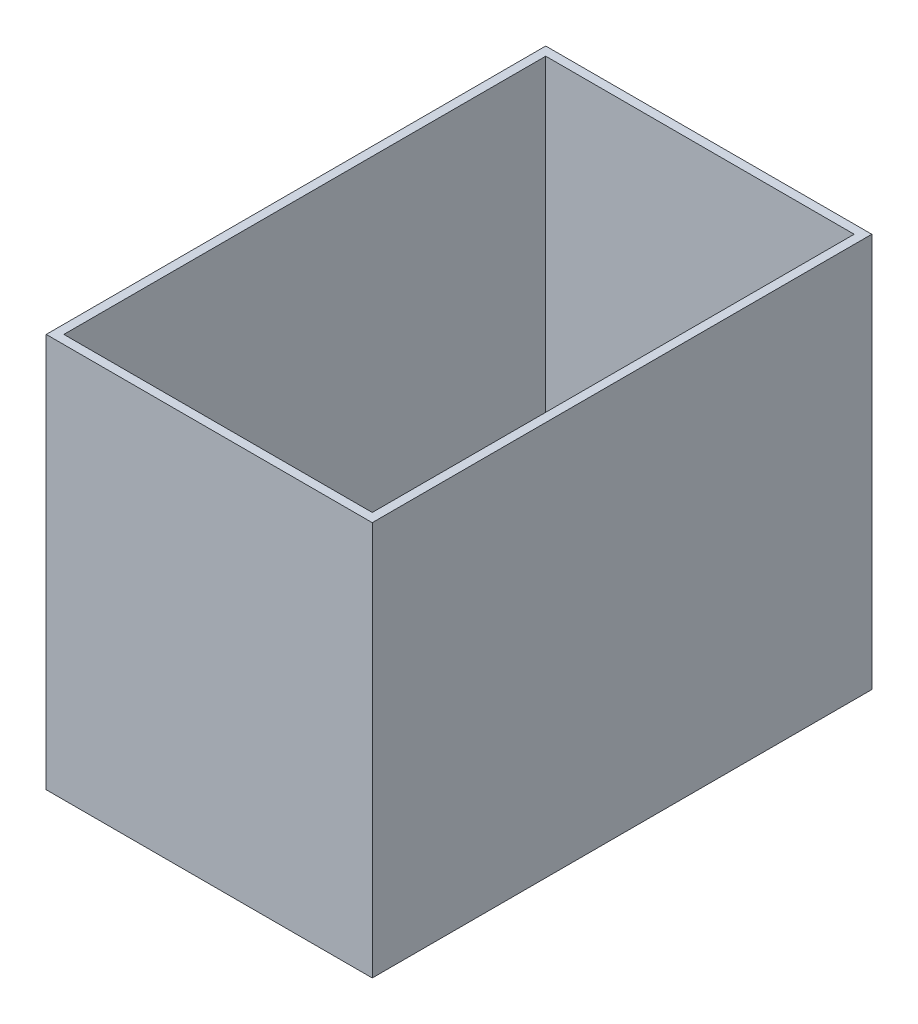
ISO-10303-21;
HEADER;
FILE_DESCRIPTION(('STEP AP214'),'2;1');
FILE_NAME('part.step','',(''),(''),'','','');
FILE_SCHEMA(('AUTOMOTIVE_DESIGN { 1 0 10303 214 1 1 1 1 }'));
ENDSEC;
DATA;
#1=APPLICATION_CONTEXT('core data for automotive mechanical design processes');
#2=APPLICATION_PROTOCOL_DEFINITION('international standard','automotive_design',2000,#1);
#3=PRODUCT_CONTEXT('',#1,'mechanical');
#4=PRODUCT('Part','Part','',(#3));
#5=PRODUCT_RELATED_PRODUCT_CATEGORY('part','',(#4));
#6=PRODUCT_DEFINITION_FORMATION('','',#4);
#7=PRODUCT_DEFINITION_CONTEXT('part definition',#1,'design');
#8=PRODUCT_DEFINITION('design','',#6,#7);
#9=PRODUCT_DEFINITION_SHAPE('','',#8);
#10=(LENGTH_UNIT() NAMED_UNIT(*) SI_UNIT(.MILLI.,.METRE.));
#11=(NAMED_UNIT(*) PLANE_ANGLE_UNIT() SI_UNIT($,.RADIAN.));
#12=(NAMED_UNIT(*) SI_UNIT($,.STERADIAN.) SOLID_ANGLE_UNIT());
#13=UNCERTAINTY_MEASURE_WITH_UNIT(LENGTH_MEASURE(1.E-05),#10,'distance_accuracy_value','');
#14=(GEOMETRIC_REPRESENTATION_CONTEXT(3) GLOBAL_UNCERTAINTY_ASSIGNED_CONTEXT((#13)) GLOBAL_UNIT_ASSIGNED_CONTEXT((#10,
#11,#12)) REPRESENTATION_CONTEXT('',''));
#15=CARTESIAN_POINT('',(0.,0.,0.));
#16=DIRECTION('',(0.,0.,1.));
#17=DIRECTION('',(1.,0.,0.));
#18=AXIS2_PLACEMENT_3D('',#15,#16,#17);
#19=CARTESIAN_POINT('',(0.,3.,0.));
#20=DIRECTION('',(1.,0.,0.));
#21=DIRECTION('',(0.,0.,-1.));
#22=AXIS2_PLACEMENT_3D('',#19,#20,#21);
#23=PLANE('',#22);
#24=DIRECTION('',(0.,0.,1.));
#25=VECTOR('',#24,1.);
#26=CARTESIAN_POINT('',(0.,0.,0.));
#27=LINE('',#26,#25);
#28=CARTESIAN_POINT('',(0.,0.,0.));
#29=VERTEX_POINT('',#28);
#30=CARTESIAN_POINT('',(0.,0.,170.0625));
#31=VERTEX_POINT('',#30);
#32=EDGE_CURVE('E146',#29,#31,#27,.T.);
#33=ORIENTED_EDGE('',*,*,#32,.T.);
#34=DIRECTION('',(0.,-1.,0.));
#35=VECTOR('',#34,1.);
#36=CARTESIAN_POINT('',(0.,3.,170.0625));
#37=LINE('',#36,#35);
#38=CARTESIAN_POINT('',(0.,134.25,170.0625));
#39=VERTEX_POINT('',#38);
#40=EDGE_CURVE('E11',#39,#31,#37,.T.);
#41=ORIENTED_EDGE('',*,*,#40,.F.);
#42=DIRECTION('',(0.,0.,1.));
#43=VECTOR('',#42,1.);
#44=CARTESIAN_POINT('',(0.,134.25,0.));
#45=LINE('',#44,#43);
#46=CARTESIAN_POINT('',(0.,134.25,0.));
#47=VERTEX_POINT('',#46);
#48=EDGE_CURVE('E111',#47,#39,#45,.T.);
#49=ORIENTED_EDGE('',*,*,#48,.F.);
#50=DIRECTION('',(0.,-1.,0.));
#51=VECTOR('',#50,1.);
#52=CARTESIAN_POINT('',(0.,3.,0.));
#53=LINE('',#52,#51);
#54=EDGE_CURVE('E155',#47,#29,#53,.T.);
#55=ORIENTED_EDGE('',*,*,#54,.T.);
#56=EDGE_LOOP('',(#33,#41,#49,#55));
#57=FACE_BOUND('',#56,.T.);
#58=ADVANCED_FACE('F33',(#57),#23,.F.);
#59=CARTESIAN_POINT('',(0.,3.,170.0625));
#60=DIRECTION('',(0.,0.,-1.));
#61=DIRECTION('',(-1.,0.,0.));
#62=AXIS2_PLACEMENT_3D('',#59,#60,#61);
#63=PLANE('',#62);
#64=DIRECTION('',(1.,0.,0.));
#65=VECTOR('',#64,1.);
#66=CARTESIAN_POINT('',(0.,0.,170.0625));
#67=LINE('',#66,#65);
#68=CARTESIAN_POINT('',(111.,0.,170.0625));
#69=VERTEX_POINT('',#68);
#70=EDGE_CURVE('E149',#31,#69,#67,.T.);
#71=ORIENTED_EDGE('',*,*,#70,.T.);
#72=DIRECTION('',(0.,-1.,0.));
#73=VECTOR('',#72,1.);
#74=CARTESIAN_POINT('',(111.,3.,170.0625));
#75=LINE('',#74,#73);
#76=CARTESIAN_POINT('',(111.,134.25,170.0625));
#77=VERTEX_POINT('',#76);
#78=EDGE_CURVE('E40',#77,#69,#75,.T.);
#79=ORIENTED_EDGE('',*,*,#78,.F.);
#80=DIRECTION('',(1.,0.,0.));
#81=VECTOR('',#80,1.);
#82=CARTESIAN_POINT('',(0.,134.25,170.0625));
#83=LINE('',#82,#81);
#84=EDGE_CURVE('E137',#39,#77,#83,.T.);
#85=ORIENTED_EDGE('',*,*,#84,.F.);
#86=ORIENTED_EDGE('',*,*,#40,.T.);
#87=EDGE_LOOP('',(#71,#79,#85,#86));
#88=FACE_BOUND('',#87,.T.);
#89=ADVANCED_FACE('F177',(#88),#63,.F.);
#90=CARTESIAN_POINT('',(111.,3.,0.));
#91=DIRECTION('',(-1.,0.,0.));
#92=DIRECTION('',(0.,0.,1.));
#93=AXIS2_PLACEMENT_3D('',#90,#91,#92);
#94=PLANE('',#93);
#95=DIRECTION('',(0.,0.,-1.));
#96=VECTOR('',#95,1.);
#97=CARTESIAN_POINT('',(111.,0.,0.));
#98=LINE('',#97,#96);
#99=CARTESIAN_POINT('',(111.,0.,0.));
#100=VERTEX_POINT('',#99);
#101=EDGE_CURVE('E151',#69,#100,#98,.T.);
#102=ORIENTED_EDGE('',*,*,#101,.T.);
#103=DIRECTION('',(0.,-1.,0.));
#104=VECTOR('',#103,1.);
#105=CARTESIAN_POINT('',(111.,3.,0.));
#106=LINE('',#105,#104);
#107=CARTESIAN_POINT('',(111.,134.25,0.));
#108=VERTEX_POINT('',#107);
#109=EDGE_CURVE('E158',#108,#100,#106,.T.);
#110=ORIENTED_EDGE('',*,*,#109,.F.);
#111=DIRECTION('',(0.,0.,-1.));
#112=VECTOR('',#111,1.);
#113=CARTESIAN_POINT('',(111.,134.25,0.));
#114=LINE('',#113,#112);
#115=EDGE_CURVE('E140',#77,#108,#114,.T.);
#116=ORIENTED_EDGE('',*,*,#115,.F.);
#117=ORIENTED_EDGE('',*,*,#78,.T.);
#118=EDGE_LOOP('',(#102,#110,#116,#117));
#119=FACE_BOUND('',#118,.T.);
#120=ADVANCED_FACE('F164',(#119),#94,.F.);
#121=CARTESIAN_POINT('',(0.,3.,0.));
#122=DIRECTION('',(0.,0.,1.));
#123=DIRECTION('',(1.,0.,0.));
#124=AXIS2_PLACEMENT_3D('',#121,#122,#123);
#125=PLANE('',#124);
#126=DIRECTION('',(-1.,0.,0.));
#127=VECTOR('',#126,1.);
#128=CARTESIAN_POINT('',(0.,0.,0.));
#129=LINE('',#128,#127);
#130=EDGE_CURVE('E153',#100,#29,#129,.T.);
#131=ORIENTED_EDGE('',*,*,#130,.T.);
#132=ORIENTED_EDGE('',*,*,#54,.F.);
#133=DIRECTION('',(-1.,0.,0.));
#134=VECTOR('',#133,1.);
#135=CARTESIAN_POINT('',(0.,134.25,0.));
#136=LINE('',#135,#134);
#137=EDGE_CURVE('E143',#108,#47,#136,.T.);
#138=ORIENTED_EDGE('',*,*,#137,.F.);
#139=ORIENTED_EDGE('',*,*,#109,.T.);
#140=EDGE_LOOP('',(#131,#132,#138,#139));
#141=FACE_BOUND('',#140,.T.);
#142=ADVANCED_FACE('F172',(#141),#125,.F.);
#143=CARTESIAN_POINT('',(0.,0.,0.));
#144=DIRECTION('',(0.,1.,0.));
#145=DIRECTION('',(0.,0.,1.));
#146=AXIS2_PLACEMENT_3D('',#143,#144,#145);
#147=PLANE('',#146);
#148=CARTESIAN_POINT('',(55.5,0.,85.03125));
#149=DIRECTION('',(0.,-1.,0.));
#150=DIRECTION('',(0.,0.,-1.));
#151=AXIS2_PLACEMENT_3D('',#148,#149,#150);
#152=CIRCLE('',#151,47.);
#153=CARTESIAN_POINT('',(55.5,0.,38.03125));
#154=VERTEX_POINT('',#153);
#155=EDGE_CURVE('E218',#154,#154,#152,.T.);
#156=ORIENTED_EDGE('',*,*,#155,.F.);
#157=EDGE_LOOP('',(#156));
#158=FACE_BOUND('',#157,.T.);
#159=ORIENTED_EDGE('',*,*,#32,.F.);
#160=ORIENTED_EDGE('',*,*,#130,.F.);
#161=ORIENTED_EDGE('',*,*,#101,.F.);
#162=ORIENTED_EDGE('',*,*,#70,.F.);
#163=EDGE_LOOP('',(#159,#160,#161,#162));
#164=FACE_BOUND('',#163,.T.);
#165=ADVANCED_FACE('F170',(#158,#164),#147,.F.);
#166=CARTESIAN_POINT('',(0.,134.25,0.));
#167=DIRECTION('',(0.,1.,0.));
#168=DIRECTION('',(0.,0.,1.));
#169=AXIS2_PLACEMENT_3D('',#166,#167,#168);
#170=PLANE('',#169);
#171=ORIENTED_EDGE('',*,*,#48,.T.);
#172=ORIENTED_EDGE('',*,*,#84,.T.);
#173=ORIENTED_EDGE('',*,*,#115,.T.);
#174=ORIENTED_EDGE('',*,*,#137,.T.);
#175=EDGE_LOOP('',(#171,#172,#173,#174));
#176=FACE_BOUND('',#175,.T.);
#177=DIRECTION('',(0.,0.,1.));
#178=VECTOR('',#177,1.);
#179=CARTESIAN_POINT('',(3.,134.25,3.));
#180=LINE('',#179,#178);
#181=CARTESIAN_POINT('',(3.,134.25,3.));
#182=VERTEX_POINT('',#181);
#183=CARTESIAN_POINT('',(3.00000000000002,134.25,167.0625));
#184=VERTEX_POINT('',#183);
#185=EDGE_CURVE('E105',#182,#184,#180,.T.);
#186=ORIENTED_EDGE('',*,*,#185,.F.);
#187=DIRECTION('',(-1.,0.,0.));
#188=VECTOR('',#187,1.);
#189=CARTESIAN_POINT('',(3.,134.25,3.));
#190=LINE('',#189,#188);
#191=CARTESIAN_POINT('',(108.,134.25,3.));
#192=VERTEX_POINT('',#191);
#193=EDGE_CURVE('E96',#192,#182,#190,.T.);
#194=ORIENTED_EDGE('',*,*,#193,.F.);
#195=DIRECTION('',(0.,0.,-1.));
#196=VECTOR('',#195,1.);
#197=CARTESIAN_POINT('',(108.,134.25,3.));
#198=LINE('',#197,#196);
#199=CARTESIAN_POINT('',(108.,134.25,167.0625));
#200=VERTEX_POINT('',#199);
#201=EDGE_CURVE('E119',#200,#192,#198,.T.);
#202=ORIENTED_EDGE('',*,*,#201,.F.);
#203=DIRECTION('',(1.,0.,0.));
#204=VECTOR('',#203,1.);
#205=CARTESIAN_POINT('',(3.00000000000002,134.25,167.0625));
#206=LINE('',#205,#204);
#207=EDGE_CURVE('E117',#184,#200,#206,.T.);
#208=ORIENTED_EDGE('',*,*,#207,.F.);
#209=EDGE_LOOP('',(#186,#194,#202,#208));
#210=FACE_BOUND('',#209,.T.);
#211=ADVANCED_FACE('F115',(#176,#210),#170,.T.);
#212=CARTESIAN_POINT('',(3.,134.25,3.));
#213=DIRECTION('',(0.,0.,1.));
#214=DIRECTION('',(1.,0.,0.));
#215=AXIS2_PLACEMENT_3D('',#212,#213,#214);
#216=PLANE('',#215);
#217=DIRECTION('',(-1.,0.,0.));
#218=VECTOR('',#217,1.);
#219=CARTESIAN_POINT('',(3.,3.,3.));
#220=LINE('',#219,#218);
#221=CARTESIAN_POINT('',(108.,3.,3.));
#222=VERTEX_POINT('',#221);
#223=CARTESIAN_POINT('',(3.,3.,3.));
#224=VERTEX_POINT('',#223);
#225=EDGE_CURVE('E47',#222,#224,#220,.T.);
#226=ORIENTED_EDGE('',*,*,#225,.F.);
#227=DIRECTION('',(0.,-1.,0.));
#228=VECTOR('',#227,1.);
#229=CARTESIAN_POINT('',(108.,134.25,3.));
#230=LINE('',#229,#228);
#231=EDGE_CURVE('E101',#192,#222,#230,.T.);
#232=ORIENTED_EDGE('',*,*,#231,.F.);
#233=ORIENTED_EDGE('',*,*,#193,.T.);
#234=DIRECTION('',(0.,-1.,0.));
#235=VECTOR('',#234,1.);
#236=CARTESIAN_POINT('',(3.,134.25,3.));
#237=LINE('',#236,#235);
#238=EDGE_CURVE('E99',#182,#224,#237,.T.);
#239=ORIENTED_EDGE('',*,*,#238,.T.);
#240=EDGE_LOOP('',(#226,#232,#233,#239));
#241=FACE_BOUND('',#240,.T.);
#242=ADVANCED_FACE('F98',(#241),#216,.T.);
#243=CARTESIAN_POINT('',(3.,134.25,3.));
#244=DIRECTION('',(1.,0.,0.));
#245=DIRECTION('',(0.,0.,-1.));
#246=AXIS2_PLACEMENT_3D('',#243,#244,#245);
#247=PLANE('',#246);
#248=DIRECTION('',(0.,0.,1.));
#249=VECTOR('',#248,1.);
#250=CARTESIAN_POINT('',(3.,3.,3.));
#251=LINE('',#250,#249);
#252=CARTESIAN_POINT('',(3.00000000000002,3.,167.0625));
#253=VERTEX_POINT('',#252);
#254=EDGE_CURVE('E51',#224,#253,#251,.T.);
#255=ORIENTED_EDGE('',*,*,#254,.F.);
#256=ORIENTED_EDGE('',*,*,#238,.F.);
#257=ORIENTED_EDGE('',*,*,#185,.T.);
#258=DIRECTION('',(0.,-1.,0.));
#259=VECTOR('',#258,1.);
#260=CARTESIAN_POINT('',(3.00000000000002,134.25,167.0625));
#261=LINE('',#260,#259);
#262=EDGE_CURVE('E112',#184,#253,#261,.T.);
#263=ORIENTED_EDGE('',*,*,#262,.T.);
#264=EDGE_LOOP('',(#255,#256,#257,#263));
#265=FACE_BOUND('',#264,.T.);
#266=ADVANCED_FACE('F109',(#265),#247,.T.);
#267=CARTESIAN_POINT('',(3.00000000000002,134.25,167.0625));
#268=DIRECTION('',(0.,0.,-1.));
#269=DIRECTION('',(-1.,0.,0.));
#270=AXIS2_PLACEMENT_3D('',#267,#268,#269);
#271=PLANE('',#270);
#272=DIRECTION('',(1.,0.,0.));
#273=VECTOR('',#272,1.);
#274=CARTESIAN_POINT('',(3.00000000000002,3.,167.0625));
#275=LINE('',#274,#273);
#276=CARTESIAN_POINT('',(108.,3.,167.0625));
#277=VERTEX_POINT('',#276);
#278=EDGE_CURVE('E127',#253,#277,#275,.T.);
#279=ORIENTED_EDGE('',*,*,#278,.F.);
#280=ORIENTED_EDGE('',*,*,#262,.F.);
#281=ORIENTED_EDGE('',*,*,#207,.T.);
#282=DIRECTION('',(0.,-1.,0.));
#283=VECTOR('',#282,1.);
#284=CARTESIAN_POINT('',(108.,134.25,167.0625));
#285=LINE('',#284,#283);
#286=EDGE_CURVE('E131',#200,#277,#285,.T.);
#287=ORIENTED_EDGE('',*,*,#286,.T.);
#288=EDGE_LOOP('',(#279,#280,#281,#287));
#289=FACE_BOUND('',#288,.T.);
#290=ADVANCED_FACE('F202',(#289),#271,.T.);
#291=CARTESIAN_POINT('',(108.,134.25,3.));
#292=DIRECTION('',(-1.,0.,0.));
#293=DIRECTION('',(0.,0.,1.));
#294=AXIS2_PLACEMENT_3D('',#291,#292,#293);
#295=PLANE('',#294);
#296=DIRECTION('',(0.,0.,-1.));
#297=VECTOR('',#296,1.);
#298=CARTESIAN_POINT('',(108.,3.,3.));
#299=LINE('',#298,#297);
#300=EDGE_CURVE('E106',#277,#222,#299,.T.);
#301=ORIENTED_EDGE('',*,*,#300,.F.);
#302=ORIENTED_EDGE('',*,*,#286,.F.);
#303=ORIENTED_EDGE('',*,*,#201,.T.);
#304=ORIENTED_EDGE('',*,*,#231,.T.);
#305=EDGE_LOOP('',(#301,#302,#303,#304));
#306=FACE_BOUND('',#305,.T.);
#307=ADVANCED_FACE('F194',(#306),#295,.T.);
#308=CARTESIAN_POINT('',(0.,3.,0.));
#309=DIRECTION('',(0.,1.,0.));
#310=DIRECTION('',(0.,0.,1.));
#311=AXIS2_PLACEMENT_3D('',#308,#309,#310);
#312=PLANE('',#311);
#313=CARTESIAN_POINT('',(55.5,3.,85.03125));
#314=DIRECTION('',(0.,-1.,0.));
#315=DIRECTION('',(0.,0.,-1.));
#316=AXIS2_PLACEMENT_3D('',#313,#314,#315);
#317=CIRCLE('',#316,47.);
#318=CARTESIAN_POINT('',(55.5,3.,38.03125));
#319=VERTEX_POINT('',#318);
#320=EDGE_CURVE('E125',#319,#319,#317,.T.);
#321=ORIENTED_EDGE('',*,*,#320,.T.);
#322=EDGE_LOOP('',(#321));
#323=FACE_BOUND('',#322,.T.);
#324=ORIENTED_EDGE('',*,*,#225,.T.);
#325=ORIENTED_EDGE('',*,*,#254,.T.);
#326=ORIENTED_EDGE('',*,*,#278,.T.);
#327=ORIENTED_EDGE('',*,*,#300,.T.);
#328=EDGE_LOOP('',(#324,#325,#326,#327));
#329=FACE_BOUND('',#328,.T.);
#330=ADVANCED_FACE('F190',(#323,#329),#312,.T.);
#331=CARTESIAN_POINT('',(55.5,3.,85.03125));
#332=DIRECTION('',(0.,-1.,0.));
#333=DIRECTION('',(0.,0.,-1.));
#334=AXIS2_PLACEMENT_3D('',#331,#332,#333);
#335=CYLINDRICAL_SURFACE('',#334,47.);
#336=ORIENTED_EDGE('',*,*,#320,.F.);
#337=EDGE_LOOP('',(#336));
#338=FACE_BOUND('',#337,.T.);
#339=ORIENTED_EDGE('',*,*,#155,.T.);
#340=EDGE_LOOP('',(#339));
#341=FACE_BOUND('',#340,.T.);
#342=ADVANCED_FACE('F193',(#338,#341),#335,.F.);
#343=CLOSED_SHELL('',(#58,#89,#120,#142,#165,#211,#242,#266,#290,#307,#330,#342));
#344=MANIFOLD_SOLID_BREP('B2',#343);
#345=ADVANCED_BREP_SHAPE_REPRESENTATION('',(#18,#344),#14);
#346=SHAPE_DEFINITION_REPRESENTATION(#9,#345);
ENDSEC;
END-ISO-10303-21;
